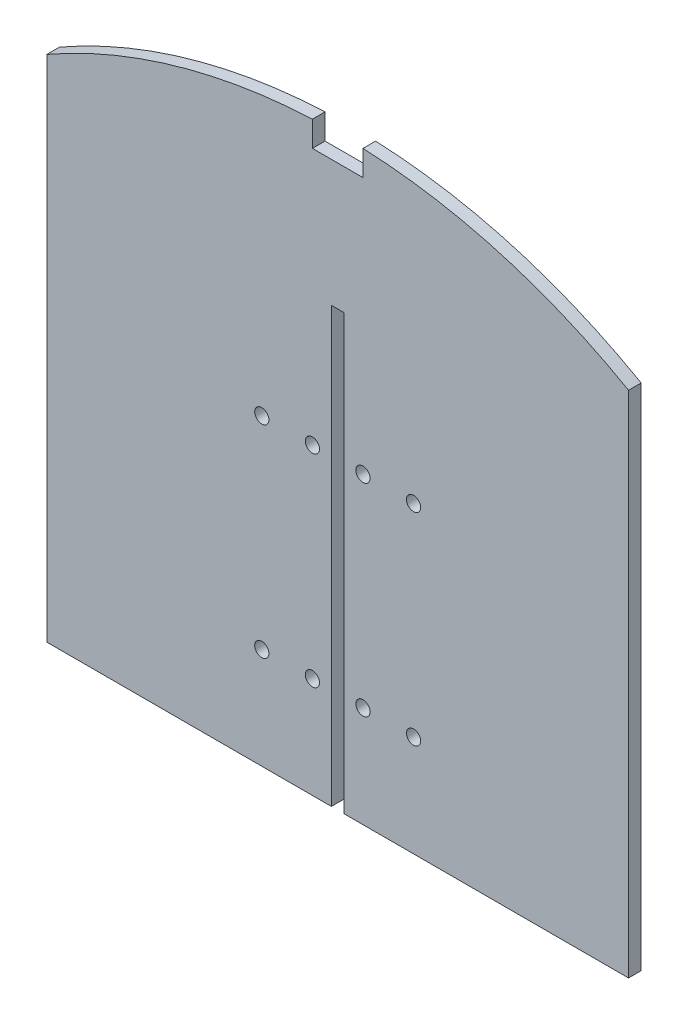
ISO-10303-21;
HEADER;
FILE_DESCRIPTION(('STEP AP214'),'2;1');
FILE_NAME('part.step','',(''),(''),'','','');
FILE_SCHEMA(('AUTOMOTIVE_DESIGN { 1 0 10303 214 1 1 1 1 }'));
ENDSEC;
DATA;
#1=APPLICATION_CONTEXT('core data for automotive mechanical design processes');
#2=APPLICATION_PROTOCOL_DEFINITION('international standard','automotive_design',2000,#1);
#3=PRODUCT_CONTEXT('',#1,'mechanical');
#4=PRODUCT('Part','Part','',(#3));
#5=PRODUCT_RELATED_PRODUCT_CATEGORY('part','',(#4));
#6=PRODUCT_DEFINITION_FORMATION('','',#4);
#7=PRODUCT_DEFINITION_CONTEXT('part definition',#1,'design');
#8=PRODUCT_DEFINITION('design','',#6,#7);
#9=PRODUCT_DEFINITION_SHAPE('','',#8);
#10=(LENGTH_UNIT() NAMED_UNIT(*) SI_UNIT(.MILLI.,.METRE.));
#11=(NAMED_UNIT(*) PLANE_ANGLE_UNIT() SI_UNIT($,.RADIAN.));
#12=(NAMED_UNIT(*) SI_UNIT($,.STERADIAN.) SOLID_ANGLE_UNIT());
#13=UNCERTAINTY_MEASURE_WITH_UNIT(LENGTH_MEASURE(1.E-05),#10,'distance_accuracy_value','');
#14=(GEOMETRIC_REPRESENTATION_CONTEXT(3) GLOBAL_UNCERTAINTY_ASSIGNED_CONTEXT((#13)) GLOBAL_UNIT_ASSIGNED_CONTEXT((#10,
#11,#12)) REPRESENTATION_CONTEXT('',''));
#15=CARTESIAN_POINT('',(0.,0.,0.));
#16=DIRECTION('',(0.,0.,1.));
#17=DIRECTION('',(1.,0.,0.));
#18=AXIS2_PLACEMENT_3D('',#15,#16,#17);
#19=CARTESIAN_POINT('',(0.,0.,6.35));
#20=DIRECTION('',(0.,0.,-1.));
#21=DIRECTION('',(-1.,0.,0.));
#22=AXIS2_PLACEMENT_3D('',#19,#20,#21);
#23=CYLINDRICAL_SURFACE('',#22,294.386);
#24=CARTESIAN_POINT('',(0.,0.,0.));
#25=DIRECTION('',(0.,0.,1.));
#26=DIRECTION('',(-1.,0.,0.));
#27=AXIS2_PLACEMENT_3D('',#24,#25,#26);
#28=CIRCLE('',#27,294.386);
#29=CARTESIAN_POINT('',(-12.7,294.111929367035,0.));
#30=VERTEX_POINT('',#29);
#31=CARTESIAN_POINT('',(-146.05,255.602258393779,0.));
#32=VERTEX_POINT('',#31);
#33=EDGE_CURVE('E156',#30,#32,#28,.T.);
#34=ORIENTED_EDGE('',*,*,#33,.T.);
#35=DIRECTION('',(0.,0.,-1.));
#36=VECTOR('',#35,1.);
#37=CARTESIAN_POINT('',(-146.05,255.602258393779,6.35));
#38=LINE('',#37,#36);
#39=CARTESIAN_POINT('',(-146.05,255.602258393779,6.35));
#40=VERTEX_POINT('',#39);
#41=EDGE_CURVE('E11',#40,#32,#38,.T.);
#42=ORIENTED_EDGE('',*,*,#41,.F.);
#43=CARTESIAN_POINT('',(0.,0.,6.35));
#44=DIRECTION('',(0.,0.,1.));
#45=DIRECTION('',(-1.,0.,0.));
#46=AXIS2_PLACEMENT_3D('',#43,#44,#45);
#47=CIRCLE('',#46,294.386);
#48=CARTESIAN_POINT('',(-12.7,294.111929367035,6.35));
#49=VERTEX_POINT('',#48);
#50=EDGE_CURVE('E179',#49,#40,#47,.T.);
#51=ORIENTED_EDGE('',*,*,#50,.F.);
#52=DIRECTION('',(0.,0.,-1.));
#53=VECTOR('',#52,1.);
#54=CARTESIAN_POINT('',(-12.7,294.111929367035,6.35));
#55=LINE('',#54,#53);
#56=EDGE_CURVE('E152',#49,#30,#55,.T.);
#57=ORIENTED_EDGE('',*,*,#56,.T.);
#58=EDGE_LOOP('',(#34,#42,#51,#57));
#59=FACE_BOUND('',#58,.T.);
#60=ADVANCED_FACE('F34',(#59),#23,.T.);
#61=CARTESIAN_POINT('',(-146.05,255.602258393779,6.35));
#62=DIRECTION('',(1.,0.,0.));
#63=DIRECTION('',(0.,0.,-1.));
#64=AXIS2_PLACEMENT_3D('',#61,#62,#63);
#65=PLANE('',#64);
#66=DIRECTION('',(0.,-1.,0.));
#67=VECTOR('',#66,1.);
#68=CARTESIAN_POINT('',(-146.05,255.602258393779,0.));
#69=LINE('',#68,#67);
#70=CARTESIAN_POINT('',(-146.05,0.,0.));
#71=VERTEX_POINT('',#70);
#72=EDGE_CURVE('E159',#32,#71,#69,.T.);
#73=ORIENTED_EDGE('',*,*,#72,.T.);
#74=DIRECTION('',(0.,0.,-1.));
#75=VECTOR('',#74,1.);
#76=CARTESIAN_POINT('',(-146.05,0.,6.35));
#77=LINE('',#76,#75);
#78=CARTESIAN_POINT('',(-146.05,0.,6.35));
#79=VERTEX_POINT('',#78);
#80=EDGE_CURVE('E43',#79,#71,#77,.T.);
#81=ORIENTED_EDGE('',*,*,#80,.F.);
#82=DIRECTION('',(0.,-1.,0.));
#83=VECTOR('',#82,1.);
#84=CARTESIAN_POINT('',(-146.05,255.602258393779,6.35));
#85=LINE('',#84,#83);
#86=EDGE_CURVE('E107',#40,#79,#85,.T.);
#87=ORIENTED_EDGE('',*,*,#86,.F.);
#88=ORIENTED_EDGE('',*,*,#41,.T.);
#89=EDGE_LOOP('',(#73,#81,#87,#88));
#90=FACE_BOUND('',#89,.T.);
#91=ADVANCED_FACE('F293',(#90),#65,.F.);
#92=CARTESIAN_POINT('',(-146.05,0.,6.35));
#93=DIRECTION('',(0.,1.,0.));
#94=DIRECTION('',(0.,0.,1.));
#95=AXIS2_PLACEMENT_3D('',#92,#93,#94);
#96=PLANE('',#95);
#97=DIRECTION('',(1.,0.,0.));
#98=VECTOR('',#97,1.);
#99=CARTESIAN_POINT('',(-146.05,0.,0.));
#100=LINE('',#99,#98);
#101=CARTESIAN_POINT('',(-3.17500000000003,0.,0.));
#102=VERTEX_POINT('',#101);
#103=EDGE_CURVE('E162',#71,#102,#100,.T.);
#104=ORIENTED_EDGE('',*,*,#103,.T.);
#105=DIRECTION('',(0.,0.,-1.));
#106=VECTOR('',#105,1.);
#107=CARTESIAN_POINT('',(-3.17500000000003,0.,6.35));
#108=LINE('',#107,#106);
#109=CARTESIAN_POINT('',(-3.17500000000003,0.,6.35));
#110=VERTEX_POINT('',#109);
#111=EDGE_CURVE('E198',#110,#102,#108,.T.);
#112=ORIENTED_EDGE('',*,*,#111,.F.);
#113=DIRECTION('',(1.,0.,0.));
#114=VECTOR('',#113,1.);
#115=CARTESIAN_POINT('',(-146.05,0.,6.35));
#116=LINE('',#115,#114);
#117=EDGE_CURVE('E253',#79,#110,#116,.T.);
#118=ORIENTED_EDGE('',*,*,#117,.F.);
#119=ORIENTED_EDGE('',*,*,#80,.T.);
#120=EDGE_LOOP('',(#104,#112,#118,#119));
#121=FACE_BOUND('',#120,.T.);
#122=ADVANCED_FACE('F297',(#121),#96,.F.);
#123=CARTESIAN_POINT('',(-3.17500000000003,0.,6.35));
#124=DIRECTION('',(-1.,0.,0.));
#125=DIRECTION('',(0.,-1.,0.));
#126=AXIS2_PLACEMENT_3D('',#123,#124,#125);
#127=PLANE('',#126);
#128=DIRECTION('',(0.,1.,0.));
#129=VECTOR('',#128,1.);
#130=CARTESIAN_POINT('',(-3.17500000000003,0.,0.));
#131=LINE('',#130,#129);
#132=CARTESIAN_POINT('',(-3.175,217.911929367035,0.));
#133=VERTEX_POINT('',#132);
#134=EDGE_CURVE('E164',#102,#133,#131,.T.);
#135=ORIENTED_EDGE('',*,*,#134,.T.);
#136=DIRECTION('',(0.,0.,-1.));
#137=VECTOR('',#136,1.);
#138=CARTESIAN_POINT('',(-3.175,217.911929367035,6.35));
#139=LINE('',#138,#137);
#140=CARTESIAN_POINT('',(-3.175,217.911929367035,6.35));
#141=VERTEX_POINT('',#140);
#142=EDGE_CURVE('E195',#141,#133,#139,.T.);
#143=ORIENTED_EDGE('',*,*,#142,.F.);
#144=DIRECTION('',(0.,1.,0.));
#145=VECTOR('',#144,1.);
#146=CARTESIAN_POINT('',(-3.17500000000003,0.,6.35));
#147=LINE('',#146,#145);
#148=EDGE_CURVE('E255',#110,#141,#147,.T.);
#149=ORIENTED_EDGE('',*,*,#148,.F.);
#150=ORIENTED_EDGE('',*,*,#111,.T.);
#151=EDGE_LOOP('',(#135,#143,#149,#150));
#152=FACE_BOUND('',#151,.T.);
#153=ADVANCED_FACE('F301',(#152),#127,.F.);
#154=CARTESIAN_POINT('',(-3.175,217.911929367035,6.35));
#155=DIRECTION('',(0.,1.,0.));
#156=DIRECTION('',(0.,0.,1.));
#157=AXIS2_PLACEMENT_3D('',#154,#155,#156);
#158=PLANE('',#157);
#159=DIRECTION('',(1.,0.,0.));
#160=VECTOR('',#159,1.);
#161=CARTESIAN_POINT('',(-3.175,217.911929367035,0.));
#162=LINE('',#161,#160);
#163=CARTESIAN_POINT('',(3.175,217.911929367035,0.));
#164=VERTEX_POINT('',#163);
#165=EDGE_CURVE('E166',#133,#164,#162,.T.);
#166=ORIENTED_EDGE('',*,*,#165,.T.);
#167=DIRECTION('',(0.,0.,-1.));
#168=VECTOR('',#167,1.);
#169=CARTESIAN_POINT('',(3.175,217.911929367035,6.35));
#170=LINE('',#169,#168);
#171=CARTESIAN_POINT('',(3.175,217.911929367035,6.35));
#172=VERTEX_POINT('',#171);
#173=EDGE_CURVE('E192',#172,#164,#170,.T.);
#174=ORIENTED_EDGE('',*,*,#173,.F.);
#175=DIRECTION('',(1.,0.,0.));
#176=VECTOR('',#175,1.);
#177=CARTESIAN_POINT('',(-3.175,217.911929367035,6.35));
#178=LINE('',#177,#176);
#179=EDGE_CURVE('E257',#141,#172,#178,.T.);
#180=ORIENTED_EDGE('',*,*,#179,.F.);
#181=ORIENTED_EDGE('',*,*,#142,.T.);
#182=EDGE_LOOP('',(#166,#174,#180,#181));
#183=FACE_BOUND('',#182,.T.);
#184=ADVANCED_FACE('F307',(#183),#158,.F.);
#185=CARTESIAN_POINT('',(3.175,217.911929367035,6.35));
#186=DIRECTION('',(1.,0.,0.));
#187=DIRECTION('',(0.,1.,0.));
#188=AXIS2_PLACEMENT_3D('',#185,#186,#187);
#189=PLANE('',#188);
#190=DIRECTION('',(0.,-1.,0.));
#191=VECTOR('',#190,1.);
#192=CARTESIAN_POINT('',(3.175,217.911929367035,0.));
#193=LINE('',#192,#191);
#194=CARTESIAN_POINT('',(3.17500000000003,0.,0.));
#195=VERTEX_POINT('',#194);
#196=EDGE_CURVE('E168',#164,#195,#193,.T.);
#197=ORIENTED_EDGE('',*,*,#196,.T.);
#198=DIRECTION('',(0.,0.,-1.));
#199=VECTOR('',#198,1.);
#200=CARTESIAN_POINT('',(3.17500000000003,0.,6.35));
#201=LINE('',#200,#199);
#202=CARTESIAN_POINT('',(3.17500000000003,0.,6.35));
#203=VERTEX_POINT('',#202);
#204=EDGE_CURVE('E189',#203,#195,#201,.T.);
#205=ORIENTED_EDGE('',*,*,#204,.F.);
#206=DIRECTION('',(0.,-1.,0.));
#207=VECTOR('',#206,1.);
#208=CARTESIAN_POINT('',(3.175,217.911929367035,6.35));
#209=LINE('',#208,#207);
#210=EDGE_CURVE('E259',#172,#203,#209,.T.);
#211=ORIENTED_EDGE('',*,*,#210,.F.);
#212=ORIENTED_EDGE('',*,*,#173,.T.);
#213=EDGE_LOOP('',(#197,#205,#211,#212));
#214=FACE_BOUND('',#213,.T.);
#215=ADVANCED_FACE('F311',(#214),#189,.F.);
#216=CARTESIAN_POINT('',(3.17500000000003,0.,6.35));
#217=DIRECTION('',(0.,1.,0.));
#218=DIRECTION('',(0.,0.,1.));
#219=AXIS2_PLACEMENT_3D('',#216,#217,#218);
#220=PLANE('',#219);
#221=DIRECTION('',(1.,0.,0.));
#222=VECTOR('',#221,1.);
#223=CARTESIAN_POINT('',(3.17500000000003,0.,0.));
#224=LINE('',#223,#222);
#225=CARTESIAN_POINT('',(146.05,0.,0.));
#226=VERTEX_POINT('',#225);
#227=EDGE_CURVE('E170',#195,#226,#224,.T.);
#228=ORIENTED_EDGE('',*,*,#227,.T.);
#229=DIRECTION('',(0.,0.,-1.));
#230=VECTOR('',#229,1.);
#231=CARTESIAN_POINT('',(146.05,0.,6.35));
#232=LINE('',#231,#230);
#233=CARTESIAN_POINT('',(146.05,0.,6.35));
#234=VERTEX_POINT('',#233);
#235=EDGE_CURVE('E186',#234,#226,#232,.T.);
#236=ORIENTED_EDGE('',*,*,#235,.F.);
#237=DIRECTION('',(1.,0.,0.));
#238=VECTOR('',#237,1.);
#239=CARTESIAN_POINT('',(3.17500000000003,0.,6.35));
#240=LINE('',#239,#238);
#241=EDGE_CURVE('E261',#203,#234,#240,.T.);
#242=ORIENTED_EDGE('',*,*,#241,.F.);
#243=ORIENTED_EDGE('',*,*,#204,.T.);
#244=EDGE_LOOP('',(#228,#236,#242,#243));
#245=FACE_BOUND('',#244,.T.);
#246=ADVANCED_FACE('F315',(#245),#220,.F.);
#247=CARTESIAN_POINT('',(146.05,255.602258393779,6.35));
#248=DIRECTION('',(-1.,0.,0.));
#249=DIRECTION('',(0.,0.,1.));
#250=AXIS2_PLACEMENT_3D('',#247,#248,#249);
#251=PLANE('',#250);
#252=DIRECTION('',(0.,1.,0.));
#253=VECTOR('',#252,1.);
#254=CARTESIAN_POINT('',(146.05,255.602258393779,0.));
#255=LINE('',#254,#253);
#256=CARTESIAN_POINT('',(146.05,255.602258393779,0.));
#257=VERTEX_POINT('',#256);
#258=EDGE_CURVE('E172',#226,#257,#255,.T.);
#259=ORIENTED_EDGE('',*,*,#258,.T.);
#260=DIRECTION('',(0.,0.,-1.));
#261=VECTOR('',#260,1.);
#262=CARTESIAN_POINT('',(146.05,255.602258393779,6.35));
#263=LINE('',#262,#261);
#264=CARTESIAN_POINT('',(146.05,255.602258393779,6.35));
#265=VERTEX_POINT('',#264);
#266=EDGE_CURVE('E183',#265,#257,#263,.T.);
#267=ORIENTED_EDGE('',*,*,#266,.F.);
#268=DIRECTION('',(0.,1.,0.));
#269=VECTOR('',#268,1.);
#270=CARTESIAN_POINT('',(146.05,255.602258393779,6.35));
#271=LINE('',#270,#269);
#272=EDGE_CURVE('E263',#234,#265,#271,.T.);
#273=ORIENTED_EDGE('',*,*,#272,.F.);
#274=ORIENTED_EDGE('',*,*,#235,.T.);
#275=EDGE_LOOP('',(#259,#267,#273,#274));
#276=FACE_BOUND('',#275,.T.);
#277=ADVANCED_FACE('F269',(#276),#251,.F.);
#278=CARTESIAN_POINT('',(0.,0.,6.35));
#279=DIRECTION('',(0.,0.,-1.));
#280=DIRECTION('',(-1.,0.,0.));
#281=AXIS2_PLACEMENT_3D('',#278,#279,#280);
#282=CYLINDRICAL_SURFACE('',#281,294.386);
#283=CARTESIAN_POINT('',(0.,0.,0.));
#284=DIRECTION('',(0.,0.,1.));
#285=DIRECTION('',(-1.,0.,0.));
#286=AXIS2_PLACEMENT_3D('',#283,#284,#285);
#287=CIRCLE('',#286,294.386);
#288=CARTESIAN_POINT('',(12.7,294.111929367035,0.));
#289=VERTEX_POINT('',#288);
#290=EDGE_CURVE('E174',#257,#289,#287,.T.);
#291=ORIENTED_EDGE('',*,*,#290,.T.);
#292=DIRECTION('',(0.,0.,-1.));
#293=VECTOR('',#292,1.);
#294=CARTESIAN_POINT('',(12.7,294.111929367035,6.35));
#295=LINE('',#294,#293);
#296=CARTESIAN_POINT('',(12.7,294.111929367035,6.35));
#297=VERTEX_POINT('',#296);
#298=EDGE_CURVE('E147',#297,#289,#295,.T.);
#299=ORIENTED_EDGE('',*,*,#298,.F.);
#300=CARTESIAN_POINT('',(0.,0.,6.35));
#301=DIRECTION('',(0.,0.,1.));
#302=DIRECTION('',(-1.,0.,0.));
#303=AXIS2_PLACEMENT_3D('',#300,#301,#302);
#304=CIRCLE('',#303,294.386);
#305=EDGE_CURVE('E138',#265,#297,#304,.T.);
#306=ORIENTED_EDGE('',*,*,#305,.F.);
#307=ORIENTED_EDGE('',*,*,#266,.T.);
#308=EDGE_LOOP('',(#291,#299,#306,#307));
#309=FACE_BOUND('',#308,.T.);
#310=ADVANCED_FACE('F273',(#309),#282,.T.);
#311=CARTESIAN_POINT('',(12.7,281.411929367035,6.35));
#312=DIRECTION('',(1.,0.,0.));
#313=DIRECTION('',(0.,1.,0.));
#314=AXIS2_PLACEMENT_3D('',#311,#312,#313);
#315=PLANE('',#314);
#316=DIRECTION('',(0.,-1.,0.));
#317=VECTOR('',#316,1.);
#318=CARTESIAN_POINT('',(12.7,281.411929367035,0.));
#319=LINE('',#318,#317);
#320=CARTESIAN_POINT('',(12.7,281.411929367035,0.));
#321=VERTEX_POINT('',#320);
#322=EDGE_CURVE('E146',#289,#321,#319,.T.);
#323=ORIENTED_EDGE('',*,*,#322,.T.);
#324=DIRECTION('',(0.,0.,-1.));
#325=VECTOR('',#324,1.);
#326=CARTESIAN_POINT('',(12.7,281.411929367035,6.35));
#327=LINE('',#326,#325);
#328=CARTESIAN_POINT('',(12.7,281.411929367035,6.35));
#329=VERTEX_POINT('',#328);
#330=EDGE_CURVE('E143',#329,#321,#327,.T.);
#331=ORIENTED_EDGE('',*,*,#330,.F.);
#332=DIRECTION('',(0.,-1.,0.));
#333=VECTOR('',#332,1.);
#334=CARTESIAN_POINT('',(12.7,281.411929367035,6.35));
#335=LINE('',#334,#333);
#336=EDGE_CURVE('E132',#297,#329,#335,.T.);
#337=ORIENTED_EDGE('',*,*,#336,.F.);
#338=ORIENTED_EDGE('',*,*,#298,.T.);
#339=EDGE_LOOP('',(#323,#331,#337,#338));
#340=FACE_BOUND('',#339,.T.);
#341=ADVANCED_FACE('F144',(#340),#315,.F.);
#342=CARTESIAN_POINT('',(-12.7,281.411929367035,6.35));
#343=DIRECTION('',(0.,-1.,0.));
#344=DIRECTION('',(0.,0.,-1.));
#345=AXIS2_PLACEMENT_3D('',#342,#343,#344);
#346=PLANE('',#345);
#347=DIRECTION('',(-1.,0.,0.));
#348=VECTOR('',#347,1.);
#349=CARTESIAN_POINT('',(-12.7,281.411929367035,0.));
#350=LINE('',#349,#348);
#351=CARTESIAN_POINT('',(-12.7,281.411929367035,0.));
#352=VERTEX_POINT('',#351);
#353=EDGE_CURVE('E93',#321,#352,#350,.T.);
#354=ORIENTED_EDGE('',*,*,#353,.T.);
#355=DIRECTION('',(0.,0.,-1.));
#356=VECTOR('',#355,1.);
#357=CARTESIAN_POINT('',(-12.7,281.411929367035,6.35));
#358=LINE('',#357,#356);
#359=CARTESIAN_POINT('',(-12.7,281.411929367035,6.35));
#360=VERTEX_POINT('',#359);
#361=EDGE_CURVE('E148',#360,#352,#358,.T.);
#362=ORIENTED_EDGE('',*,*,#361,.F.);
#363=DIRECTION('',(-1.,0.,0.));
#364=VECTOR('',#363,1.);
#365=CARTESIAN_POINT('',(-12.7,281.411929367035,6.35));
#366=LINE('',#365,#364);
#367=EDGE_CURVE('E136',#329,#360,#366,.T.);
#368=ORIENTED_EDGE('',*,*,#367,.F.);
#369=ORIENTED_EDGE('',*,*,#330,.T.);
#370=EDGE_LOOP('',(#354,#362,#368,#369));
#371=FACE_BOUND('',#370,.T.);
#372=ADVANCED_FACE('F150',(#371),#346,.F.);
#373=CARTESIAN_POINT('',(-12.7,294.111929367035,6.35));
#374=DIRECTION('',(-1.,0.,0.));
#375=DIRECTION('',(0.,-1.,0.));
#376=AXIS2_PLACEMENT_3D('',#373,#374,#375);
#377=PLANE('',#376);
#378=DIRECTION('',(0.,1.,0.));
#379=VECTOR('',#378,1.);
#380=CARTESIAN_POINT('',(-12.7,294.111929367035,0.));
#381=LINE('',#380,#379);
#382=EDGE_CURVE('E99',#352,#30,#381,.T.);
#383=ORIENTED_EDGE('',*,*,#382,.T.);
#384=ORIENTED_EDGE('',*,*,#56,.F.);
#385=DIRECTION('',(0.,1.,0.));
#386=VECTOR('',#385,1.);
#387=CARTESIAN_POINT('',(-12.7,294.111929367035,6.35));
#388=LINE('',#387,#386);
#389=EDGE_CURVE('E52',#360,#49,#388,.T.);
#390=ORIENTED_EDGE('',*,*,#389,.F.);
#391=ORIENTED_EDGE('',*,*,#361,.T.);
#392=EDGE_LOOP('',(#383,#384,#390,#391));
#393=FACE_BOUND('',#392,.T.);
#394=ADVANCED_FACE('F281',(#393),#377,.F.);
#395=CARTESIAN_POINT('',(0.,0.,6.35));
#396=DIRECTION('',(0.,0.,-1.));
#397=DIRECTION('',(-1.,0.,0.));
#398=AXIS2_PLACEMENT_3D('',#395,#396,#397);
#399=PLANE('',#398);
#400=CARTESIAN_POINT('',(12.6999999999996,152.4,6.34999999999999));
#401=DIRECTION('',(0.,0.,-1.));
#402=DIRECTION('',(-1.,0.,0.));
#403=AXIS2_PLACEMENT_3D('',#400,#401,#402);
#404=CIRCLE('',#403,3.5687);
#405=CARTESIAN_POINT('',(9.13129999999964,152.4,6.34999999999999));
#406=VERTEX_POINT('',#405);
#407=EDGE_CURVE('E228',#406,#406,#404,.F.);
#408=ORIENTED_EDGE('',*,*,#407,.F.);
#409=EDGE_LOOP('',(#408));
#410=FACE_BOUND('',#409,.T.);
#411=CARTESIAN_POINT('',(38.0999999999996,152.4,6.34999999999999));
#412=DIRECTION('',(0.,0.,-1.));
#413=DIRECTION('',(-1.,0.,0.));
#414=AXIS2_PLACEMENT_3D('',#411,#412,#413);
#415=CIRCLE('',#414,3.5687);
#416=CARTESIAN_POINT('',(34.5312999999996,152.4,6.34999999999999));
#417=VERTEX_POINT('',#416);
#418=EDGE_CURVE('E225',#417,#417,#415,.F.);
#419=ORIENTED_EDGE('',*,*,#418,.F.);
#420=EDGE_LOOP('',(#419));
#421=FACE_BOUND('',#420,.T.);
#422=CARTESIAN_POINT('',(38.1,50.8,6.34999999999999));
#423=DIRECTION('',(0.,0.,-1.));
#424=DIRECTION('',(-1.,0.,0.));
#425=AXIS2_PLACEMENT_3D('',#422,#423,#424);
#426=CIRCLE('',#425,3.56869999999999);
#427=CARTESIAN_POINT('',(34.5313,50.8,6.34999999999999));
#428=VERTEX_POINT('',#427);
#429=EDGE_CURVE('E222',#428,#428,#426,.F.);
#430=ORIENTED_EDGE('',*,*,#429,.F.);
#431=EDGE_LOOP('',(#430));
#432=FACE_BOUND('',#431,.T.);
#433=CARTESIAN_POINT('',(12.7,50.8,6.34999999999999));
#434=DIRECTION('',(0.,0.,-1.));
#435=DIRECTION('',(-1.,0.,0.));
#436=AXIS2_PLACEMENT_3D('',#433,#434,#435);
#437=CIRCLE('',#436,3.5687);
#438=CARTESIAN_POINT('',(9.1313,50.8,6.34999999999999));
#439=VERTEX_POINT('',#438);
#440=EDGE_CURVE('E218',#439,#439,#437,.F.);
#441=ORIENTED_EDGE('',*,*,#440,.F.);
#442=EDGE_LOOP('',(#441));
#443=FACE_BOUND('',#442,.T.);
#444=CARTESIAN_POINT('',(-38.1,50.8,6.34999999999999));
#445=DIRECTION('',(0.,0.,-1.));
#446=DIRECTION('',(-1.,0.,0.));
#447=AXIS2_PLACEMENT_3D('',#444,#445,#446);
#448=CIRCLE('',#447,3.56869999999999);
#449=CARTESIAN_POINT('',(-41.6687,50.8,6.34999999999999));
#450=VERTEX_POINT('',#449);
#451=EDGE_CURVE('E214',#450,#450,#448,.T.);
#452=ORIENTED_EDGE('',*,*,#451,.T.);
#453=EDGE_LOOP('',(#452));
#454=FACE_BOUND('',#453,.T.);
#455=CARTESIAN_POINT('',(-12.7,50.8,6.34999999999999));
#456=DIRECTION('',(0.,0.,-1.));
#457=DIRECTION('',(-1.,0.,0.));
#458=AXIS2_PLACEMENT_3D('',#455,#456,#457);
#459=CIRCLE('',#458,3.5687);
#460=CARTESIAN_POINT('',(-16.2687,50.8,6.34999999999999));
#461=VERTEX_POINT('',#460);
#462=EDGE_CURVE('E210',#461,#461,#459,.T.);
#463=ORIENTED_EDGE('',*,*,#462,.T.);
#464=EDGE_LOOP('',(#463));
#465=FACE_BOUND('',#464,.T.);
#466=CARTESIAN_POINT('',(-12.6999999999996,152.4,6.34999999999999));
#467=DIRECTION('',(0.,0.,-1.));
#468=DIRECTION('',(-1.,0.,0.));
#469=AXIS2_PLACEMENT_3D('',#466,#467,#468);
#470=CIRCLE('',#469,3.5687);
#471=CARTESIAN_POINT('',(-16.2686999999996,152.4,6.34999999999999));
#472=VERTEX_POINT('',#471);
#473=EDGE_CURVE('E206',#472,#472,#470,.T.);
#474=ORIENTED_EDGE('',*,*,#473,.T.);
#475=EDGE_LOOP('',(#474));
#476=FACE_BOUND('',#475,.T.);
#477=CARTESIAN_POINT('',(-38.0999999999996,152.4,6.34999999999999));
#478=DIRECTION('',(0.,0.,-1.));
#479=DIRECTION('',(-1.,0.,0.));
#480=AXIS2_PLACEMENT_3D('',#477,#478,#479);
#481=CIRCLE('',#480,3.5687);
#482=CARTESIAN_POINT('',(-41.6686999999996,152.4,6.34999999999999));
#483=VERTEX_POINT('',#482);
#484=EDGE_CURVE('E160',#483,#483,#481,.T.);
#485=ORIENTED_EDGE('',*,*,#484,.T.);
#486=EDGE_LOOP('',(#485));
#487=FACE_BOUND('',#486,.T.);
#488=ORIENTED_EDGE('',*,*,#50,.T.);
#489=ORIENTED_EDGE('',*,*,#86,.T.);
#490=ORIENTED_EDGE('',*,*,#117,.T.);
#491=ORIENTED_EDGE('',*,*,#148,.T.);
#492=ORIENTED_EDGE('',*,*,#179,.T.);
#493=ORIENTED_EDGE('',*,*,#210,.T.);
#494=ORIENTED_EDGE('',*,*,#241,.T.);
#495=ORIENTED_EDGE('',*,*,#272,.T.);
#496=ORIENTED_EDGE('',*,*,#305,.T.);
#497=ORIENTED_EDGE('',*,*,#336,.T.);
#498=ORIENTED_EDGE('',*,*,#367,.T.);
#499=ORIENTED_EDGE('',*,*,#389,.T.);
#500=EDGE_LOOP('',(#488,#489,#490,#491,#492,#493,#494,#495,#496,#497,#498,#499));
#501=FACE_BOUND('',#500,.T.);
#502=ADVANCED_FACE('F134',(#410,#421,#432,#443,#454,#465,#476,#487,#501),#399,.F.);
#503=CARTESIAN_POINT('',(0.,0.,0.));
#504=DIRECTION('',(0.,0.,-1.));
#505=DIRECTION('',(-1.,0.,0.));
#506=AXIS2_PLACEMENT_3D('',#503,#504,#505);
#507=PLANE('',#506);
#508=CARTESIAN_POINT('',(12.6999999999996,152.4,0.));
#509=DIRECTION('',(0.,0.,-1.));
#510=DIRECTION('',(-1.,0.,0.));
#511=AXIS2_PLACEMENT_3D('',#508,#509,#510);
#512=CIRCLE('',#511,3.5687);
#513=CARTESIAN_POINT('',(9.13129999999964,152.4,0.));
#514=VERTEX_POINT('',#513);
#515=EDGE_CURVE('E37',#514,#514,#512,.F.);
#516=ORIENTED_EDGE('',*,*,#515,.T.);
#517=EDGE_LOOP('',(#516));
#518=FACE_BOUND('',#517,.T.);
#519=CARTESIAN_POINT('',(38.0999999999996,152.4,0.));
#520=DIRECTION('',(0.,0.,-1.));
#521=DIRECTION('',(-1.,0.,0.));
#522=AXIS2_PLACEMENT_3D('',#519,#520,#521);
#523=CIRCLE('',#522,3.5687);
#524=CARTESIAN_POINT('',(34.5312999999996,152.4,0.));
#525=VERTEX_POINT('',#524);
#526=EDGE_CURVE('E226',#525,#525,#523,.F.);
#527=ORIENTED_EDGE('',*,*,#526,.T.);
#528=EDGE_LOOP('',(#527));
#529=FACE_BOUND('',#528,.T.);
#530=CARTESIAN_POINT('',(38.1,50.8,0.));
#531=DIRECTION('',(0.,0.,-1.));
#532=DIRECTION('',(-1.,0.,0.));
#533=AXIS2_PLACEMENT_3D('',#530,#531,#532);
#534=CIRCLE('',#533,3.56869999999999);
#535=CARTESIAN_POINT('',(34.5313,50.8,0.));
#536=VERTEX_POINT('',#535);
#537=EDGE_CURVE('E223',#536,#536,#534,.F.);
#538=ORIENTED_EDGE('',*,*,#537,.T.);
#539=EDGE_LOOP('',(#538));
#540=FACE_BOUND('',#539,.T.);
#541=CARTESIAN_POINT('',(12.7,50.8,0.));
#542=DIRECTION('',(0.,0.,-1.));
#543=DIRECTION('',(-1.,0.,0.));
#544=AXIS2_PLACEMENT_3D('',#541,#542,#543);
#545=CIRCLE('',#544,3.5687);
#546=CARTESIAN_POINT('',(9.1313,50.8,0.));
#547=VERTEX_POINT('',#546);
#548=EDGE_CURVE('E219',#547,#547,#545,.F.);
#549=ORIENTED_EDGE('',*,*,#548,.T.);
#550=EDGE_LOOP('',(#549));
#551=FACE_BOUND('',#550,.T.);
#552=CARTESIAN_POINT('',(-38.1,50.8,0.));
#553=DIRECTION('',(0.,0.,-1.));
#554=DIRECTION('',(-1.,0.,0.));
#555=AXIS2_PLACEMENT_3D('',#552,#553,#554);
#556=CIRCLE('',#555,3.56869999999999);
#557=CARTESIAN_POINT('',(-41.6687,50.8,0.));
#558=VERTEX_POINT('',#557);
#559=EDGE_CURVE('E215',#558,#558,#556,.T.);
#560=ORIENTED_EDGE('',*,*,#559,.F.);
#561=EDGE_LOOP('',(#560));
#562=FACE_BOUND('',#561,.T.);
#563=CARTESIAN_POINT('',(-12.7,50.8,0.));
#564=DIRECTION('',(0.,0.,-1.));
#565=DIRECTION('',(-1.,0.,0.));
#566=AXIS2_PLACEMENT_3D('',#563,#564,#565);
#567=CIRCLE('',#566,3.5687);
#568=CARTESIAN_POINT('',(-16.2687,50.8,0.));
#569=VERTEX_POINT('',#568);
#570=EDGE_CURVE('E211',#569,#569,#567,.T.);
#571=ORIENTED_EDGE('',*,*,#570,.F.);
#572=EDGE_LOOP('',(#571));
#573=FACE_BOUND('',#572,.T.);
#574=CARTESIAN_POINT('',(-12.6999999999996,152.4,0.));
#575=DIRECTION('',(0.,0.,-1.));
#576=DIRECTION('',(-1.,0.,0.));
#577=AXIS2_PLACEMENT_3D('',#574,#575,#576);
#578=CIRCLE('',#577,3.5687);
#579=CARTESIAN_POINT('',(-16.2686999999996,152.4,0.));
#580=VERTEX_POINT('',#579);
#581=EDGE_CURVE('E207',#580,#580,#578,.T.);
#582=ORIENTED_EDGE('',*,*,#581,.F.);
#583=EDGE_LOOP('',(#582));
#584=FACE_BOUND('',#583,.T.);
#585=CARTESIAN_POINT('',(-38.0999999999996,152.4,0.));
#586=DIRECTION('',(0.,0.,-1.));
#587=DIRECTION('',(-1.,0.,0.));
#588=AXIS2_PLACEMENT_3D('',#585,#586,#587);
#589=CIRCLE('',#588,3.5687);
#590=CARTESIAN_POINT('',(-41.6686999999996,152.4,0.));
#591=VERTEX_POINT('',#590);
#592=EDGE_CURVE('E203',#591,#591,#589,.T.);
#593=ORIENTED_EDGE('',*,*,#592,.F.);
#594=EDGE_LOOP('',(#593));
#595=FACE_BOUND('',#594,.T.);
#596=ORIENTED_EDGE('',*,*,#33,.F.);
#597=ORIENTED_EDGE('',*,*,#382,.F.);
#598=ORIENTED_EDGE('',*,*,#353,.F.);
#599=ORIENTED_EDGE('',*,*,#322,.F.);
#600=ORIENTED_EDGE('',*,*,#290,.F.);
#601=ORIENTED_EDGE('',*,*,#258,.F.);
#602=ORIENTED_EDGE('',*,*,#227,.F.);
#603=ORIENTED_EDGE('',*,*,#196,.F.);
#604=ORIENTED_EDGE('',*,*,#165,.F.);
#605=ORIENTED_EDGE('',*,*,#134,.F.);
#606=ORIENTED_EDGE('',*,*,#103,.F.);
#607=ORIENTED_EDGE('',*,*,#72,.F.);
#608=EDGE_LOOP('',(#596,#597,#598,#599,#600,#601,#602,#603,#604,#605,#606,#607));
#609=FACE_BOUND('',#608,.T.);
#610=ADVANCED_FACE('F276',(#518,#529,#540,#551,#562,#573,#584,#595,#609),#507,.T.);
#611=CARTESIAN_POINT('',(-38.0999999999996,152.4,148.336));
#612=DIRECTION('',(0.,0.,-1.));
#613=DIRECTION('',(-1.,0.,0.));
#614=AXIS2_PLACEMENT_3D('',#611,#612,#613);
#615=CYLINDRICAL_SURFACE('',#614,3.5687);
#616=ORIENTED_EDGE('',*,*,#592,.T.);
#617=EDGE_LOOP('',(#616));
#618=FACE_BOUND('',#617,.T.);
#619=ORIENTED_EDGE('',*,*,#484,.F.);
#620=EDGE_LOOP('',(#619));
#621=FACE_BOUND('',#620,.T.);
#622=ADVANCED_FACE('F352',(#618,#621),#615,.F.);
#623=CARTESIAN_POINT('',(-12.6999999999996,152.4,148.336));
#624=DIRECTION('',(0.,0.,-1.));
#625=DIRECTION('',(-1.,0.,0.));
#626=AXIS2_PLACEMENT_3D('',#623,#624,#625);
#627=CYLINDRICAL_SURFACE('',#626,3.5687);
#628=ORIENTED_EDGE('',*,*,#581,.T.);
#629=EDGE_LOOP('',(#628));
#630=FACE_BOUND('',#629,.T.);
#631=ORIENTED_EDGE('',*,*,#473,.F.);
#632=EDGE_LOOP('',(#631));
#633=FACE_BOUND('',#632,.T.);
#634=ADVANCED_FACE('F361',(#630,#633),#627,.F.);
#635=CARTESIAN_POINT('',(-12.7,50.8,148.336));
#636=DIRECTION('',(0.,0.,-1.));
#637=DIRECTION('',(-1.,0.,0.));
#638=AXIS2_PLACEMENT_3D('',#635,#636,#637);
#639=CYLINDRICAL_SURFACE('',#638,3.5687);
#640=ORIENTED_EDGE('',*,*,#570,.T.);
#641=EDGE_LOOP('',(#640));
#642=FACE_BOUND('',#641,.T.);
#643=ORIENTED_EDGE('',*,*,#462,.F.);
#644=EDGE_LOOP('',(#643));
#645=FACE_BOUND('',#644,.T.);
#646=ADVANCED_FACE('F371',(#642,#645),#639,.F.);
#647=CARTESIAN_POINT('',(-38.1,50.8,148.336));
#648=DIRECTION('',(0.,0.,-1.));
#649=DIRECTION('',(-1.,0.,0.));
#650=AXIS2_PLACEMENT_3D('',#647,#648,#649);
#651=CYLINDRICAL_SURFACE('',#650,3.56869999999999);
#652=ORIENTED_EDGE('',*,*,#559,.T.);
#653=EDGE_LOOP('',(#652));
#654=FACE_BOUND('',#653,.T.);
#655=ORIENTED_EDGE('',*,*,#451,.F.);
#656=EDGE_LOOP('',(#655));
#657=FACE_BOUND('',#656,.T.);
#658=ADVANCED_FACE('F381',(#654,#657),#651,.F.);
#659=CARTESIAN_POINT('',(12.7,50.8,148.336));
#660=DIRECTION('',(0.,0.,-1.));
#661=DIRECTION('',(-1.,0.,0.));
#662=AXIS2_PLACEMENT_3D('',#659,#660,#661);
#663=CYLINDRICAL_SURFACE('',#662,3.5687);
#664=ORIENTED_EDGE('',*,*,#548,.F.);
#665=EDGE_LOOP('',(#664));
#666=FACE_BOUND('',#665,.T.);
#667=ORIENTED_EDGE('',*,*,#440,.T.);
#668=EDGE_LOOP('',(#667));
#669=FACE_BOUND('',#668,.T.);
#670=ADVANCED_FACE('F391',(#666,#669),#663,.F.);
#671=CARTESIAN_POINT('',(38.1,50.8,148.336));
#672=DIRECTION('',(0.,0.,-1.));
#673=DIRECTION('',(-1.,0.,0.));
#674=AXIS2_PLACEMENT_3D('',#671,#672,#673);
#675=CYLINDRICAL_SURFACE('',#674,3.56869999999999);
#676=ORIENTED_EDGE('',*,*,#537,.F.);
#677=EDGE_LOOP('',(#676));
#678=FACE_BOUND('',#677,.T.);
#679=ORIENTED_EDGE('',*,*,#429,.T.);
#680=EDGE_LOOP('',(#679));
#681=FACE_BOUND('',#680,.T.);
#682=ADVANCED_FACE('F401',(#678,#681),#675,.F.);
#683=CARTESIAN_POINT('',(38.0999999999996,152.4,148.336));
#684=DIRECTION('',(0.,0.,-1.));
#685=DIRECTION('',(-1.,0.,0.));
#686=AXIS2_PLACEMENT_3D('',#683,#684,#685);
#687=CYLINDRICAL_SURFACE('',#686,3.5687);
#688=ORIENTED_EDGE('',*,*,#526,.F.);
#689=EDGE_LOOP('',(#688));
#690=FACE_BOUND('',#689,.T.);
#691=ORIENTED_EDGE('',*,*,#418,.T.);
#692=EDGE_LOOP('',(#691));
#693=FACE_BOUND('',#692,.T.);
#694=ADVANCED_FACE('F411',(#690,#693),#687,.F.);
#695=CARTESIAN_POINT('',(12.6999999999996,152.4,148.336));
#696=DIRECTION('',(0.,0.,-1.));
#697=DIRECTION('',(-1.,0.,0.));
#698=AXIS2_PLACEMENT_3D('',#695,#696,#697);
#699=CYLINDRICAL_SURFACE('',#698,3.5687);
#700=ORIENTED_EDGE('',*,*,#515,.F.);
#701=EDGE_LOOP('',(#700));
#702=FACE_BOUND('',#701,.T.);
#703=ORIENTED_EDGE('',*,*,#407,.T.);
#704=EDGE_LOOP('',(#703));
#705=FACE_BOUND('',#704,.T.);
#706=ADVANCED_FACE('F421',(#702,#705),#699,.F.);
#707=CLOSED_SHELL('',(#60,#91,#122,#153,#184,#215,#246,#277,#310,#341,#372,#394,#502,#610,#622,
#634,#646,#658,#670,#682,#694,#706));
#708=MANIFOLD_SOLID_BREP('B2',#707);
#709=ADVANCED_BREP_SHAPE_REPRESENTATION('',(#18,#708),#14);
#710=SHAPE_DEFINITION_REPRESENTATION(#9,#709);
ENDSEC;
END-ISO-10303-21;
